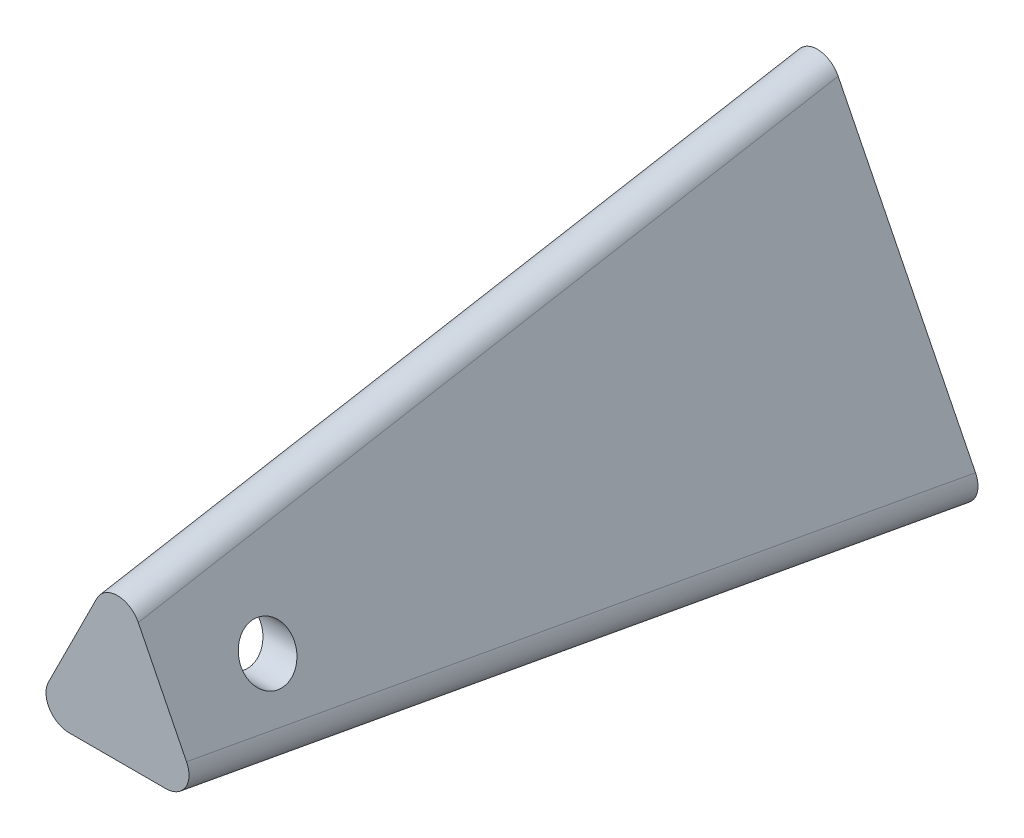
ISO-10303-21;
HEADER;
FILE_DESCRIPTION(('STEP AP214'),'2;1');
FILE_NAME('part.step','',(''),(''),'','','');
FILE_SCHEMA(('AUTOMOTIVE_DESIGN { 1 0 10303 214 1 1 1 1 }'));
ENDSEC;
DATA;
#1=APPLICATION_CONTEXT('core data for automotive mechanical design processes');
#2=APPLICATION_PROTOCOL_DEFINITION('international standard','automotive_design',2000,#1);
#3=PRODUCT_CONTEXT('',#1,'mechanical');
#4=PRODUCT('Part','Part','',(#3));
#5=PRODUCT_RELATED_PRODUCT_CATEGORY('part','',(#4));
#6=PRODUCT_DEFINITION_FORMATION('','',#4);
#7=PRODUCT_DEFINITION_CONTEXT('part definition',#1,'design');
#8=PRODUCT_DEFINITION('design','',#6,#7);
#9=PRODUCT_DEFINITION_SHAPE('','',#8);
#10=(LENGTH_UNIT() NAMED_UNIT(*) SI_UNIT(.MILLI.,.METRE.));
#11=(NAMED_UNIT(*) PLANE_ANGLE_UNIT() SI_UNIT($,.RADIAN.));
#12=(NAMED_UNIT(*) SI_UNIT($,.STERADIAN.) SOLID_ANGLE_UNIT());
#13=UNCERTAINTY_MEASURE_WITH_UNIT(LENGTH_MEASURE(1.E-05),#10,'distance_accuracy_value','');
#14=(GEOMETRIC_REPRESENTATION_CONTEXT(3) GLOBAL_UNCERTAINTY_ASSIGNED_CONTEXT((#13)) GLOBAL_UNIT_ASSIGNED_CONTEXT((#10,
#11,#12)) REPRESENTATION_CONTEXT('',''));
#15=CARTESIAN_POINT('',(0.,0.,0.));
#16=DIRECTION('',(0.,0.,1.));
#17=DIRECTION('',(1.,0.,0.));
#18=AXIS2_PLACEMENT_3D('',#15,#16,#17);
#19=CARTESIAN_POINT('',(0.,0.,0.));
#20=DIRECTION('',(0.,-0.996917333733128,0.0784590957278448));
#21=DIRECTION('',(0.,-0.0784590957278451,-0.996917333733125));
#22=AXIS2_PLACEMENT_3D('',#19,#20,#21);
#23=PLANE('',#22);
#24=DIRECTION('',(0.999999999999996,0.,0.));
#25=VECTOR('',#24,1.);
#26=CARTESIAN_POINT('',(0.,0.,0.));
#27=LINE('',#26,#25);
#28=CARTESIAN_POINT('',(4.09713717008346,0.,0.));
#29=VERTEX_POINT('',#28);
#30=CARTESIAN_POINT('',(34.0028628299165,-1.38777878078145E-13,0.));
#31=VERTEX_POINT('',#30);
#32=EDGE_CURVE('E177',#29,#31,#27,.T.);
#33=ORIENTED_EDGE('',*,*,#32,.T.);
#34=DIRECTION('',(-0.125938714811686,0.0778344062531012,0.988979901370499));
#35=VECTOR('',#34,1.);
#36=CARTESIAN_POINT('',(33.4635583876249,0.333308475619881,4.23508573153003));
#37=LINE('',#36,#35);
#38=CARTESIAN_POINT('',(33.5823794250142,0.259873035934749,3.30199999999997));
#39=VERTEX_POINT('',#38);
#40=EDGE_CURVE('E209',#31,#39,#37,.T.);
#41=ORIENTED_EDGE('',*,*,#40,.T.);
#42=DIRECTION('',(-0.999999999999996,0.,0.));
#43=VECTOR('',#42,1.);
#44=CARTESIAN_POINT('',(0.,0.259873035934888,3.30199999999997));
#45=LINE('',#44,#43);
#46=CARTESIAN_POINT('',(4.51762057498568,0.259873035934888,3.30200000000003));
#47=VERTEX_POINT('',#46);
#48=EDGE_CURVE('E156',#47,#39,#45,.F.);
#49=ORIENTED_EDGE('',*,*,#48,.F.);
#50=DIRECTION('',(0.125938714811685,0.0778344062531015,0.988979901370499));
#51=VECTOR('',#50,1.);
#52=CARTESIAN_POINT('',(4.03215428062631,-0.0401616343717048,-0.510301948866365));
#53=LINE('',#52,#51);
#54=EDGE_CURVE('E202',#47,#29,#53,.F.);
#55=ORIENTED_EDGE('',*,*,#54,.T.);
#56=EDGE_LOOP('',(#33,#41,#49,#55));
#57=FACE_BOUND('',#56,.T.);
#58=ADVANCED_FACE('F53',(#57),#23,.T.);
#59=DIRECTION('',(-0.999999999999996,0.,0.));
#60=VECTOR('',#59,1.);
#61=CARTESIAN_POINT('',(0.,5.73719702410105,72.8979999999993));
#62=LINE('',#61,#60);
#63=CARTESIAN_POINT('',(13.3801169552338,5.73719702410105,72.8979999999996));
#64=VERTEX_POINT('',#63);
#65=CARTESIAN_POINT('',(24.7198830447663,5.73719702410132,72.8979999999993));
#66=VERTEX_POINT('',#65);
#67=EDGE_CURVE('E163',#64,#66,#62,.F.);
#68=ORIENTED_EDGE('',*,*,#67,.T.);
#69=DIRECTION('',(-0.125938714811686,0.0778344062531012,0.988979901370499));
#70=VECTOR('',#69,1.);
#71=CARTESIAN_POINT('',(33.4635583876249,0.333308475619881,4.23508573153003));
#72=LINE('',#71,#70);
#73=CARTESIAN_POINT('',(24.2993996398639,5.99707006003622,76.1999999999993));
#74=VERTEX_POINT('',#73);
#75=EDGE_CURVE('E207',#66,#74,#72,.T.);
#76=ORIENTED_EDGE('',*,*,#75,.T.);
#77=DIRECTION('',(-0.999999999999996,0.,0.));
#78=VECTOR('',#77,1.);
#79=CARTESIAN_POINT('',(0.,5.99707006003601,76.1999999999992));
#80=LINE('',#79,#78);
#81=CARTESIAN_POINT('',(13.8006003601362,5.99707006003594,76.1999999999991));
#82=VERTEX_POINT('',#81);
#83=EDGE_CURVE('E184',#82,#74,#80,.F.);
#84=ORIENTED_EDGE('',*,*,#83,.F.);
#85=DIRECTION('',(0.125938714811685,0.0778344062531015,0.988979901370499));
#86=VECTOR('',#85,1.);
#87=CARTESIAN_POINT('',(4.03215428062631,-0.0401616343717048,-0.510301948866365));
#88=LINE('',#87,#86);
#89=EDGE_CURVE('E204',#82,#64,#88,.F.);
#90=ORIENTED_EDGE('',*,*,#89,.T.);
#91=EDGE_LOOP('',(#68,#76,#84,#90));
#92=FACE_BOUND('',#91,.T.);
#93=ADVANCED_FACE('F244',(#92),#23,.T.);
#94=CARTESIAN_POINT('',(38.1,-1.38777878078145E-13,0.));
#95=DIRECTION('',(0.891669970470043,0.445834985235024,0.0784590957278446));
#96=DIRECTION('',(-0.447213595499957,0.894427190999916,0.));
#97=AXIS2_PLACEMENT_3D('',#94,#95,#96);
#98=PLANE('',#97);
#99=CARTESIAN_POINT('',(25.2315870796983,14.1149503632102,66.04));
#100=DIRECTION('',(0.891669970470043,0.445834985235024,0.0784590957278446));
#101=DIRECTION('',(-0.452686054304685,0.878175204070813,0.154543350530668));
#102=AXIS2_PLACEMENT_3D('',#99,#100,#101);
#103=ELLIPSE('',#102,2.99101695506699,2.667);
#104=CARTESIAN_POINT('',(23.8775954159507,16.7415872881054,66.5022417817301));
#105=VERTEX_POINT('',#104);
#106=EDGE_CURVE('E147',#105,#105,#103,.T.);
#107=ORIENTED_EDGE('',*,*,#106,.F.);
#108=EDGE_LOOP('',(#107));
#109=FACE_BOUND('',#108,.T.);
#110=DIRECTION('',(0.447213595499957,-0.894427190999916,0.));
#111=VECTOR('',#110,1.);
#112=CARTESIAN_POINT('',(25.1160574719723,12.5580287359865,76.1999999999994));
#113=LINE('',#112,#111);
#114=CARTESIAN_POINT('',(26.5642413648578,9.66166095021531,76.1999999999994));
#115=VERTEX_POINT('',#114);
#116=CARTESIAN_POINT('',(21.3148417249939,20.1604602299433,76.1999999999995));
#117=VERTEX_POINT('',#116);
#118=EDGE_CURVE('E180',#115,#117,#113,.F.);
#119=ORIENTED_EDGE('',*,*,#118,.F.);
#120=DIRECTION('',(-0.125938714811686,0.0778344062531012,0.988979901370499));
#121=VECTOR('',#120,1.);
#122=CARTESIAN_POINT('',(36.3326874443676,3.62442925580753,-0.510301948866698));
#123=LINE('',#122,#121);
#124=CARTESIAN_POINT('',(36.2677045549103,3.66459089017924,-4.9960036108132E-13));
#125=VERTEX_POINT('',#124);
#126=EDGE_CURVE('E193',#115,#125,#123,.F.);
#127=ORIENTED_EDGE('',*,*,#126,.T.);
#128=DIRECTION('',(-0.447213595499957,0.894427190999916,0.));
#129=VECTOR('',#128,1.);
#130=CARTESIAN_POINT('',(38.1,-1.38777878078145E-13,0.));
#131=LINE('',#130,#129);
#132=CARTESIAN_POINT('',(21.3148417249937,33.5703165500122,-2.22044604925031E-13));
#133=VERTEX_POINT('',#132);
#134=EDGE_CURVE('E162',#125,#133,#131,.T.);
#135=ORIENTED_EDGE('',*,*,#134,.T.);
#136=DIRECTION('',(0.,-0.173319003273375,0.984865738618374));
#137=VECTOR('',#136,1.);
#138=CARTESIAN_POINT('',(21.3148417249939,32.5618818016275,5.73031701405358));
#139=LINE('',#138,#137);
#140=EDGE_CURVE('E187',#133,#117,#139,.T.);
#141=ORIENTED_EDGE('',*,*,#140,.T.);
#142=EDGE_LOOP('',(#119,#127,#135,#141));
#143=FACE_BOUND('',#142,.T.);
#144=ADVANCED_FACE('F253',(#109,#143),#98,.T.);
#145=CARTESIAN_POINT('',(19.0499999999999,38.1,-1.66533453693773E-13));
#146=DIRECTION('',(-0.891669970470044,0.445834985235024,0.078459095727845));
#147=DIRECTION('',(-0.447213595499956,-0.894427190999916,0.));
#148=AXIS2_PLACEMENT_3D('',#145,#146,#147);
#149=PLANE('',#148);
#150=CARTESIAN_POINT('',(12.8684129203017,14.1149503632103,66.0399999999993));
#151=DIRECTION('',(-0.891669970470044,0.445834985235024,0.078459095727845));
#152=DIRECTION('',(-0.452686054304684,-0.878175204070811,-0.154543350530667));
#153=AXIS2_PLACEMENT_3D('',#150,#151,#152);
#154=ELLIPSE('',#153,2.99101695506699,2.667);
#155=CARTESIAN_POINT('',(11.514421256554,11.4883134383151,65.5777582182692));
#156=VERTEX_POINT('',#155);
#157=EDGE_CURVE('E386',#156,#156,#154,.T.);
#158=ORIENTED_EDGE('',*,*,#157,.F.);
#159=EDGE_LOOP('',(#158));
#160=FACE_BOUND('',#159,.T.);
#161=DIRECTION('',(-0.447213595499956,-0.894427190999916,0.));
#162=VECTOR('',#161,1.);
#163=CARTESIAN_POINT('',(19.0499999999999,38.1,-1.66533453693773E-13));
#164=LINE('',#163,#162);
#165=CARTESIAN_POINT('',(16.785158275006,33.5703165500122,-3.33066907387547E-13));
#166=VERTEX_POINT('',#165);
#167=CARTESIAN_POINT('',(1.83229544508949,3.66459089017918,-3.88578058618805E-13));
#168=VERTEX_POINT('',#167);
#169=EDGE_CURVE('E166',#166,#168,#164,.T.);
#170=ORIENTED_EDGE('',*,*,#169,.T.);
#171=DIRECTION('',(0.125938714811685,0.0778344062531015,0.988979901370499));
#172=VECTOR('',#171,1.);
#173=CARTESIAN_POINT('',(2.44292633149845,4.04198153256043,4.79520276761186));
#174=LINE('',#173,#172);
#175=CARTESIAN_POINT('',(11.5357586351422,9.66166095021498,76.1999999999993));
#176=VERTEX_POINT('',#175);
#177=EDGE_CURVE('E13',#168,#176,#174,.T.);
#178=ORIENTED_EDGE('',*,*,#177,.T.);
#179=DIRECTION('',(0.447213595499956,0.894427190999916,0.));
#180=VECTOR('',#179,1.);
#181=CARTESIAN_POINT('',(5.36394252802784,-2.68197126401382,76.1999999999999));
#182=LINE('',#181,#180);
#183=CARTESIAN_POINT('',(16.7851582750058,20.1604602299431,76.1999999999995));
#184=VERTEX_POINT('',#183);
#185=EDGE_CURVE('E182',#184,#176,#182,.F.);
#186=ORIENTED_EDGE('',*,*,#185,.F.);
#187=DIRECTION('',(0.,-0.173319003273375,0.984865738618374));
#188=VECTOR('',#187,1.);
#189=CARTESIAN_POINT('',(16.785158275006,33.7063858713528,-0.773198611430492));
#190=LINE('',#189,#188);
#191=EDGE_CURVE('E61',#184,#166,#190,.F.);
#192=ORIENTED_EDGE('',*,*,#191,.T.);
#193=EDGE_LOOP('',(#170,#178,#186,#192));
#194=FACE_BOUND('',#193,.T.);
#195=ADVANCED_FACE('F228',(#160,#194),#149,.T.);
#196=CARTESIAN_POINT('',(0.,0.,76.2));
#197=DIRECTION('',(0.,0.,-0.999999999999996));
#198=DIRECTION('',(-0.999999999999996,0.,0.));
#199=AXIS2_PLACEMENT_3D('',#196,#197,#198);
#200=PLANE('',#199);
#201=ORIENTED_EDGE('',*,*,#83,.T.);
#202=CARTESIAN_POINT('',(24.2740221416202,8.54492424418259,76.1999999999993));
#203=DIRECTION('',(0.,0.,-0.999999999999996));
#204=DIRECTION('',(0.850650808352037,-0.525731112119134,0.));
#205=AXIS2_PLACEMENT_3D('',#202,#203,#204);
#206=ELLIPSE('',#205,2.5683029518397,2.54);
#207=EDGE_CURVE('E223',#74,#115,#206,.F.);
#208=ORIENTED_EDGE('',*,*,#207,.T.);
#209=ORIENTED_EDGE('',*,*,#118,.T.);
#210=CARTESIAN_POINT('',(19.05,18.9929685274225,76.1999999999998));
#211=DIRECTION('',(0.,0.,-0.999999999999996));
#212=DIRECTION('',(0.,1.,0.));
#213=AXIS2_PLACEMENT_3D('',#210,#211,#212);
#214=ELLIPSE('',#213,2.5790317404718,2.54);
#215=EDGE_CURVE('E73',#117,#184,#214,.F.);
#216=ORIENTED_EDGE('',*,*,#215,.T.);
#217=ORIENTED_EDGE('',*,*,#185,.T.);
#218=CARTESIAN_POINT('',(13.8259778583801,8.54492424418225,76.1999999999993));
#219=DIRECTION('',(0.,0.,-0.999999999999996));
#220=DIRECTION('',(-0.850650808352037,-0.525731112119134,0.));
#221=AXIS2_PLACEMENT_3D('',#218,#219,#220);
#222=ELLIPSE('',#221,2.5683029518397,2.54);
#223=EDGE_CURVE('E221',#176,#82,#222,.F.);
#224=ORIENTED_EDGE('',*,*,#223,.T.);
#225=EDGE_LOOP('',(#201,#208,#209,#216,#217,#224));
#226=FACE_BOUND('',#225,.T.);
#227=ADVANCED_FACE('F241',(#226),#200,.F.);
#228=CARTESIAN_POINT('',(0.,0.,0.));
#229=DIRECTION('',(0.,0.,-0.999999999999996));
#230=DIRECTION('',(-0.999999999999996,0.,0.));
#231=AXIS2_PLACEMENT_3D('',#228,#229,#230);
#232=PLANE('',#231);
#233=ORIENTED_EDGE('',*,*,#134,.F.);
#234=CARTESIAN_POINT('',(33.9774853316725,2.54785418414624,0.));
#235=DIRECTION('',(0.,0.,-0.999999999999996));
#236=DIRECTION('',(0.850650808352037,-0.525731112119134,0.));
#237=AXIS2_PLACEMENT_3D('',#234,#235,#236);
#238=ELLIPSE('',#237,2.5683029518397,2.54);
#239=EDGE_CURVE('E200',#125,#31,#238,.T.);
#240=ORIENTED_EDGE('',*,*,#239,.T.);
#241=ORIENTED_EDGE('',*,*,#32,.F.);
#242=CARTESIAN_POINT('',(4.12251466832747,2.54785418414638,0.));
#243=DIRECTION('',(0.,0.,-0.999999999999996));
#244=DIRECTION('',(-0.850650808352037,-0.525731112119134,0.));
#245=AXIS2_PLACEMENT_3D('',#242,#243,#244);
#246=ELLIPSE('',#245,2.5683029518397,2.54);
#247=EDGE_CURVE('E198',#29,#168,#246,.T.);
#248=ORIENTED_EDGE('',*,*,#247,.T.);
#249=ORIENTED_EDGE('',*,*,#169,.F.);
#250=CARTESIAN_POINT('',(19.0499999999999,32.4028248474914,-1.66533453693773E-13));
#251=DIRECTION('',(0.,0.,-0.999999999999996));
#252=DIRECTION('',(0.,1.,0.));
#253=AXIS2_PLACEMENT_3D('',#250,#251,#252);
#254=ELLIPSE('',#253,2.5790317404718,2.54);
#255=EDGE_CURVE('E196',#166,#133,#254,.T.);
#256=ORIENTED_EDGE('',*,*,#255,.T.);
#257=EDGE_LOOP('',(#233,#240,#241,#248,#249,#256));
#258=FACE_BOUND('',#257,.T.);
#259=ADVANCED_FACE('F232',(#258),#232,.T.);
#260=CARTESIAN_POINT('',(35.1557057575079,-1.47214712124619,-0.259071934093386));
#261=DIRECTION('',(0.891669970470043,0.445834985235024,0.0784590957278446));
#262=DIRECTION('',(-0.447213595499957,0.894427190999916,0.));
#263=AXIS2_PLACEMENT_3D('',#260,#261,#262);
#264=PLANE('',#263);
#265=CARTESIAN_POINT('',(21.5284232305678,14.1149503632103,66.0399999999994));
#266=DIRECTION('',(0.891669970470043,0.445834985235024,0.0784590957278446));
#267=DIRECTION('',(-0.452686054304685,0.878175204070813,0.154543350530668));
#268=AXIS2_PLACEMENT_3D('',#265,#266,#267);
#269=ELLIPSE('',#268,2.99101695506699,2.667);
#270=CARTESIAN_POINT('',(20.1744315668201,16.7415872881055,66.5022417817295));
#271=VERTEX_POINT('',#270);
#272=EDGE_CURVE('E191',#271,#271,#269,.T.);
#273=ORIENTED_EDGE('',*,*,#272,.T.);
#274=EDGE_LOOP('',(#273));
#275=FACE_BOUND('',#274,.T.);
#276=DIRECTION('',(0.447213595499957,-0.894427190999916,0.));
#277=VECTOR('',#276,1.);
#278=CARTESIAN_POINT('',(27.2850314111476,13.6425157055738,3.30199999999986));
#279=LINE('',#278,#277);
#280=CARTESIAN_POINT('',(33.9622340434476,0.288110440973627,3.30200000000003));
#281=VERTEX_POINT('',#280);
#282=CARTESIAN_POINT('',(19.0499999999999,30.1125785278692,3.30199999999969));
#283=VERTEX_POINT('',#282);
#284=EDGE_CURVE('E136',#281,#283,#279,.F.);
#285=ORIENTED_EDGE('',*,*,#284,.F.);
#286=DIRECTION('',(0.125938714811686,-0.0778344062531012,-0.988979901370499));
#287=VECTOR('',#286,1.);
#288=CARTESIAN_POINT('',(33.9622340434476,0.288110440973627,3.30200000000003));
#289=LINE('',#288,#287);
#290=CARTESIAN_POINT('',(25.0997376631998,5.7654344291402,72.8979999999995));
#291=VERTEX_POINT('',#290);
#292=EDGE_CURVE('E214',#281,#291,#289,.F.);
#293=ORIENTED_EDGE('',*,*,#292,.T.);
#294=DIRECTION('',(0.447213595499957,-0.894427190999916,0.));
#295=VECTOR('',#294,1.);
#296=CARTESIAN_POINT('',(22.3859639022159,11.1929819511081,72.8979999999994));
#297=LINE('',#296,#295);
#298=CARTESIAN_POINT('',(19.05,17.8649097555396,72.8979999999994));
#299=VERTEX_POINT('',#298);
#300=EDGE_CURVE('E160',#291,#299,#297,.F.);
#301=ORIENTED_EDGE('',*,*,#300,.T.);
#302=DIRECTION('',(0.,0.173319003273375,-0.984865738618374));
#303=VECTOR('',#302,1.);
#304=CARTESIAN_POINT('',(19.0499999999999,30.9161545115126,-1.26423012895302));
#305=LINE('',#304,#303);
#306=EDGE_CURVE('E153',#299,#283,#305,.T.);
#307=ORIENTED_EDGE('',*,*,#306,.T.);
#308=EDGE_LOOP('',(#285,#293,#301,#307));
#309=FACE_BOUND('',#308,.T.);
#310=ADVANCED_FACE('F158',(#275,#309),#264,.F.);
#311=CARTESIAN_POINT('',(21.9942942424919,36.6278528787539,-0.259071934093469));
#312=DIRECTION('',(-0.891669970470044,0.445834985235024,0.078459095727845));
#313=DIRECTION('',(-0.447213595499956,-0.894427190999916,0.));
#314=AXIS2_PLACEMENT_3D('',#311,#312,#313);
#315=PLANE('',#314);
#316=CARTESIAN_POINT('',(16.5715767694322,14.1149503632103,66.0399999999993));
#317=DIRECTION('',(-0.891669970470044,0.445834985235024,0.078459095727845));
#318=DIRECTION('',(-0.452686054304684,-0.878175204070811,-0.154543350530667));
#319=AXIS2_PLACEMENT_3D('',#316,#317,#318);
#320=ELLIPSE('',#319,2.99101695506699,2.667);
#321=CARTESIAN_POINT('',(15.2175851056845,11.4883134383151,65.5777582182692));
#322=VERTEX_POINT('',#321);
#323=EDGE_CURVE('E188',#322,#322,#320,.T.);
#324=ORIENTED_EDGE('',*,*,#323,.T.);
#325=EDGE_LOOP('',(#324));
#326=FACE_BOUND('',#325,.T.);
#327=DIRECTION('',(0.447213595499956,0.894427190999916,0.));
#328=VECTOR('',#327,1.);
#329=CARTESIAN_POINT('',(8.09403609778429,-4.04701804889224,72.8979999999999));
#330=LINE('',#329,#328);
#331=CARTESIAN_POINT('',(13.0002623368004,5.76543442913993,72.8979999999992));
#332=VERTEX_POINT('',#331);
#333=EDGE_CURVE('E169',#299,#332,#330,.F.);
#334=ORIENTED_EDGE('',*,*,#333,.T.);
#335=DIRECTION('',(-0.125938714811685,-0.0778344062531015,-0.988979901370499));
#336=VECTOR('',#335,1.);
#337=CARTESIAN_POINT('',(13.0002623368004,5.76543442913993,72.8979999999992));
#338=LINE('',#337,#336);
#339=CARTESIAN_POINT('',(4.13776595655227,0.288110440973766,3.30199999999997));
#340=VERTEX_POINT('',#339);
#341=EDGE_CURVE('E155',#332,#340,#338,.T.);
#342=ORIENTED_EDGE('',*,*,#341,.T.);
#343=DIRECTION('',(0.447213595499956,0.894427190999916,0.));
#344=VECTOR('',#343,1.);
#345=CARTESIAN_POINT('',(3.19496858885232,-1.59748429442616,3.30200000000003));
#346=LINE('',#345,#344);
#347=EDGE_CURVE('E140',#283,#340,#346,.F.);
#348=ORIENTED_EDGE('',*,*,#347,.F.);
#349=ORIENTED_EDGE('',*,*,#306,.F.);
#350=EDGE_LOOP('',(#334,#342,#348,#349));
#351=FACE_BOUND('',#350,.T.);
#352=ADVANCED_FACE('F152',(#326,#351),#315,.F.);
#353=CARTESIAN_POINT('',(0.,0.,72.898));
#354=DIRECTION('',(0.,0.,-0.999999999999996));
#355=DIRECTION('',(-0.999999999999996,0.,0.));
#356=AXIS2_PLACEMENT_3D('',#353,#354,#355);
#357=PLANE('',#356);
#358=ORIENTED_EDGE('',*,*,#300,.F.);
#359=CARTESIAN_POINT('',(24.6945055465223,8.2850512082477,72.8979999999993));
#360=DIRECTION('',(0.,0.,-0.999999999999996));
#361=DIRECTION('',(0.850650808352037,-0.525731112119134,0.));
#362=AXIS2_PLACEMENT_3D('',#359,#360,#361);
#363=ELLIPSE('',#362,2.5683029518397,2.54);
#364=EDGE_CURVE('E218',#291,#66,#363,.T.);
#365=ORIENTED_EDGE('',*,*,#364,.T.);
#366=ORIENTED_EDGE('',*,*,#67,.F.);
#367=CARTESIAN_POINT('',(13.4054944534778,8.28505120824743,72.8979999999997));
#368=DIRECTION('',(0.,0.,-0.999999999999996));
#369=DIRECTION('',(-0.850650808352037,-0.525731112119134,0.));
#370=AXIS2_PLACEMENT_3D('',#367,#368,#369);
#371=ELLIPSE('',#370,2.5683029518397,2.54);
#372=EDGE_CURVE('E216',#64,#332,#371,.T.);
#373=ORIENTED_EDGE('',*,*,#372,.T.);
#374=ORIENTED_EDGE('',*,*,#333,.F.);
#375=EDGE_LOOP('',(#358,#365,#366,#373,#374));
#376=FACE_BOUND('',#375,.T.);
#377=ADVANCED_FACE('F291',(#376),#357,.T.);
#378=CARTESIAN_POINT('',(0.,0.,3.30199999999997));
#379=DIRECTION('',(0.,0.,-0.999999999999996));
#380=DIRECTION('',(-0.999999999999996,0.,0.));
#381=AXIS2_PLACEMENT_3D('',#378,#379,#380);
#382=PLANE('',#381);
#383=ORIENTED_EDGE('',*,*,#48,.T.);
#384=CARTESIAN_POINT('',(33.5570019267701,2.80772722008113,3.30199999999958));
#385=DIRECTION('',(0.,0.,-0.999999999999996));
#386=DIRECTION('',(0.850650808352037,-0.525731112119134,0.));
#387=AXIS2_PLACEMENT_3D('',#384,#385,#386);
#388=ELLIPSE('',#387,2.5683029518397,2.54);
#389=EDGE_CURVE('E143',#39,#281,#388,.F.);
#390=ORIENTED_EDGE('',*,*,#389,.T.);
#391=ORIENTED_EDGE('',*,*,#284,.T.);
#392=ORIENTED_EDGE('',*,*,#347,.T.);
#393=CARTESIAN_POINT('',(4.54299807322975,2.80772722008127,3.30199999999992));
#394=DIRECTION('',(0.,0.,-0.999999999999996));
#395=DIRECTION('',(-0.850650808352037,-0.525731112119134,0.));
#396=AXIS2_PLACEMENT_3D('',#393,#394,#395);
#397=ELLIPSE('',#396,2.5683029518397,2.54);
#398=EDGE_CURVE('E211',#340,#47,#397,.F.);
#399=ORIENTED_EDGE('',*,*,#398,.T.);
#400=EDGE_LOOP('',(#383,#390,#391,#392,#399));
#401=FACE_BOUND('',#400,.T.);
#402=ADVANCED_FACE('F139',(#401),#382,.F.);
#403=CARTESIAN_POINT('',(38.1,14.1149503632102,66.0399999999995));
#404=DIRECTION('',(-0.999999999999996,0.,0.));
#405=DIRECTION('',(0.,0.,0.999999999999996));
#406=AXIS2_PLACEMENT_3D('',#403,#404,#405);
#407=CYLINDRICAL_SURFACE('',#406,2.667);
#408=ORIENTED_EDGE('',*,*,#323,.F.);
#409=EDGE_LOOP('',(#408));
#410=FACE_BOUND('',#409,.T.);
#411=ORIENTED_EDGE('',*,*,#157,.T.);
#412=EDGE_LOOP('',(#411));
#413=FACE_BOUND('',#412,.T.);
#414=ADVANCED_FACE('F276',(#410,#413),#407,.F.);
#415=ORIENTED_EDGE('',*,*,#272,.F.);
#416=EDGE_LOOP('',(#415));
#417=FACE_BOUND('',#416,.T.);
#418=ORIENTED_EDGE('',*,*,#106,.T.);
#419=EDGE_LOOP('',(#418));
#420=FACE_BOUND('',#419,.T.);
#421=ADVANCED_FACE('F272',(#417,#420),#407,.F.);
#422=CARTESIAN_POINT('',(34.0678457193736,2.49200839331029,-0.709588052015042));
#423=DIRECTION('',(0.125938714811686,-0.0778344062531012,-0.988979901370499));
#424=DIRECTION('',(-0.991989298375874,0.,-0.126321937555333));
#425=AXIS2_PLACEMENT_3D('',#422,#423,#424);
#426=CYLINDRICAL_SURFACE('',#425,2.54);
#427=ORIENTED_EDGE('',*,*,#389,.F.);
#428=ORIENTED_EDGE('',*,*,#40,.F.);
#429=ORIENTED_EDGE('',*,*,#239,.F.);
#430=ORIENTED_EDGE('',*,*,#126,.F.);
#431=ORIENTED_EDGE('',*,*,#207,.F.);
#432=ORIENTED_EDGE('',*,*,#75,.F.);
#433=ORIENTED_EDGE('',*,*,#364,.F.);
#434=ORIENTED_EDGE('',*,*,#292,.F.);
#435=EDGE_LOOP('',(#427,#428,#429,#430,#431,#432,#433,#434));
#436=FACE_BOUND('',#435,.T.);
#437=ADVANCED_FACE('F249',(#436),#426,.T.);
#438=CARTESIAN_POINT('',(4.03215428062631,2.49200839331043,-0.709588052015098));
#439=DIRECTION('',(-0.125938714811685,-0.0778344062531015,-0.988979901370499));
#440=DIRECTION('',(-0.991989298375874,0.,0.126321937555332));
#441=AXIS2_PLACEMENT_3D('',#438,#439,#440);
#442=CYLINDRICAL_SURFACE('',#441,2.54);
#443=ORIENTED_EDGE('',*,*,#223,.F.);
#444=ORIENTED_EDGE('',*,*,#177,.F.);
#445=ORIENTED_EDGE('',*,*,#247,.F.);
#446=ORIENTED_EDGE('',*,*,#54,.F.);
#447=ORIENTED_EDGE('',*,*,#398,.F.);
#448=ORIENTED_EDGE('',*,*,#341,.F.);
#449=ORIENTED_EDGE('',*,*,#372,.F.);
#450=ORIENTED_EDGE('',*,*,#89,.F.);
#451=EDGE_LOOP('',(#443,#444,#445,#446,#447,#448,#449,#450));
#452=FACE_BOUND('',#451,.T.);
#453=ADVANCED_FACE('F238',(#452),#442,.T.);
#454=CARTESIAN_POINT('',(19.0499999999999,32.5739650088558,-0.972484714579225));
#455=DIRECTION('',(0.,0.173319003273375,-0.984865738618374));
#456=DIRECTION('',(0.,0.984865738618376,0.173319003273375));
#457=AXIS2_PLACEMENT_3D('',#454,#455,#456);
#458=CYLINDRICAL_SURFACE('',#457,2.54);
#459=ORIENTED_EDGE('',*,*,#215,.F.);
#460=ORIENTED_EDGE('',*,*,#140,.F.);
#461=ORIENTED_EDGE('',*,*,#255,.F.);
#462=ORIENTED_EDGE('',*,*,#191,.F.);
#463=EDGE_LOOP('',(#459,#460,#461,#462));
#464=FACE_BOUND('',#463,.T.);
#465=ADVANCED_FACE('F55',(#464),#458,.T.);
#466=CLOSED_SHELL('',(#58,#93,#144,#195,#227,#259,#310,#352,#377,#402,#414,#421,#437,#453,#465));
#467=MANIFOLD_SOLID_BREP('B2',#466);
#468=ADVANCED_BREP_SHAPE_REPRESENTATION('',(#18,#467),#14);
#469=SHAPE_DEFINITION_REPRESENTATION(#9,#468);
ENDSEC;
END-ISO-10303-21;
